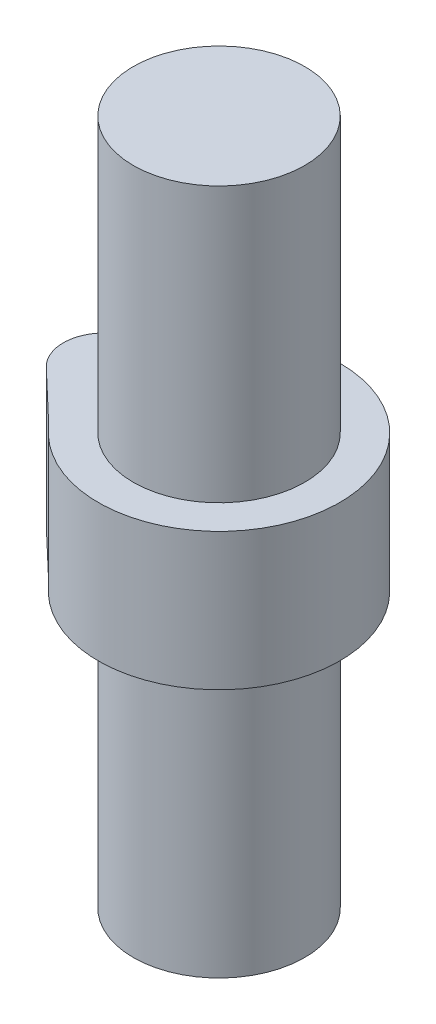
ISO-10303-21;
HEADER;
FILE_DESCRIPTION(('STEP AP214'),'2;1');
FILE_NAME('part.step','',(''),(''),'','','');
FILE_SCHEMA(('AUTOMOTIVE_DESIGN { 1 0 10303 214 1 1 1 1 }'));
ENDSEC;
DATA;
#1=APPLICATION_CONTEXT('core data for automotive mechanical design processes');
#2=APPLICATION_PROTOCOL_DEFINITION('international standard','automotive_design',2000,#1);
#3=PRODUCT_CONTEXT('',#1,'mechanical');
#4=PRODUCT('Part','Part','',(#3));
#5=PRODUCT_RELATED_PRODUCT_CATEGORY('part','',(#4));
#6=PRODUCT_DEFINITION_FORMATION('','',#4);
#7=PRODUCT_DEFINITION_CONTEXT('part definition',#1,'design');
#8=PRODUCT_DEFINITION('design','',#6,#7);
#9=PRODUCT_DEFINITION_SHAPE('','',#8);
#10=(LENGTH_UNIT() NAMED_UNIT(*) SI_UNIT(.MILLI.,.METRE.));
#11=(NAMED_UNIT(*) PLANE_ANGLE_UNIT() SI_UNIT($,.RADIAN.));
#12=(NAMED_UNIT(*) SI_UNIT($,.STERADIAN.) SOLID_ANGLE_UNIT());
#13=UNCERTAINTY_MEASURE_WITH_UNIT(LENGTH_MEASURE(1.E-05),#10,'distance_accuracy_value','');
#14=(GEOMETRIC_REPRESENTATION_CONTEXT(3) GLOBAL_UNCERTAINTY_ASSIGNED_CONTEXT((#13)) GLOBAL_UNIT_ASSIGNED_CONTEXT((#10,
#11,#12)) REPRESENTATION_CONTEXT('',''));
#15=CARTESIAN_POINT('',(0.,0.,0.));
#16=DIRECTION('',(0.,0.,1.));
#17=DIRECTION('',(1.,0.,0.));
#18=AXIS2_PLACEMENT_3D('',#15,#16,#17);
#19=CARTESIAN_POINT('',(0.,30.,0.));
#20=DIRECTION('',(0.,1.,0.));
#21=DIRECTION('',(0.,0.,1.));
#22=AXIS2_PLACEMENT_3D('',#19,#20,#21);
#23=PLANE('',#22);
#24=DIRECTION('',(-0.721222081139076,0.,0.692703911983626));
#25=VECTOR('',#24,1.);
#26=CARTESIAN_POINT('',(-6.25,30.,-6.19495762697373));
#27=LINE('',#26,#25);
#28=CARTESIAN_POINT('',(-6.25,30.,-6.19495762697373));
#29=VERTEX_POINT('',#28);
#30=CARTESIAN_POINT('',(-10.4377377549711,30.,-2.17280910838089));
#31=VERTEX_POINT('',#30);
#32=EDGE_CURVE('E93',#29,#31,#27,.T.);
#33=ORIENTED_EDGE('',*,*,#32,.T.);
#34=CARTESIAN_POINT('',(-8.35962601902018,30.,-0.00914286496365557));
#35=DIRECTION('',(0.,1.,0.));
#36=DIRECTION('',(0.,0.,1.));
#37=AXIS2_PLACEMENT_3D('',#34,#35,#36);
#38=CIRCLE('',#37,3.);
#39=CARTESIAN_POINT('',(-10.4286039599942,30.,2.16325909594576));
#40=VERTEX_POINT('',#39);
#41=EDGE_CURVE('E11',#31,#40,#38,.T.);
#42=ORIENTED_EDGE('',*,*,#41,.T.);
#43=DIRECTION('',(0.724133986969807,0.,0.689659313657991));
#44=VECTOR('',#43,1.);
#45=CARTESIAN_POINT('',(-12.7,30.,0.));
#46=LINE('',#45,#44);
#47=CARTESIAN_POINT('',(-6.65735154554284,30.,5.75496919184267));
#48=VERTEX_POINT('',#47);
#49=EDGE_CURVE('E75',#40,#48,#46,.T.);
#50=ORIENTED_EDGE('',*,*,#49,.T.);
#51=CARTESIAN_POINT('',(0.,30.,0.));
#52=DIRECTION('',(0.,1.,0.));
#53=DIRECTION('',(0.,0.,1.));
#54=AXIS2_PLACEMENT_3D('',#51,#52,#53);
#55=CIRCLE('',#54,8.8);
#56=EDGE_CURVE('E78',#48,#29,#55,.T.);
#57=ORIENTED_EDGE('',*,*,#56,.T.);
#58=EDGE_LOOP('',(#33,#42,#50,#57));
#59=FACE_BOUND('',#58,.T.);
#60=CARTESIAN_POINT('',(0.,30.,0.));
#61=DIRECTION('',(0.,1.,0.));
#62=DIRECTION('',(0.,0.,1.));
#63=AXIS2_PLACEMENT_3D('',#60,#61,#62);
#64=CIRCLE('',#63,6.25);
#65=CARTESIAN_POINT('',(0.,30.,6.25));
#66=VERTEX_POINT('',#65);
#67=EDGE_CURVE('E118',#66,#66,#64,.T.);
#68=ORIENTED_EDGE('',*,*,#67,.F.);
#69=EDGE_LOOP('',(#68));
#70=FACE_BOUND('',#69,.T.);
#71=ADVANCED_FACE('F35',(#59,#70),#23,.T.);
#72=CARTESIAN_POINT('',(0.,20.,0.));
#73=DIRECTION('',(0.,-1.,0.));
#74=DIRECTION('',(0.,0.,-1.));
#75=AXIS2_PLACEMENT_3D('',#72,#73,#74);
#76=CYLINDRICAL_SURFACE('',#75,6.25);
#77=CARTESIAN_POINT('',(0.,20.,0.));
#78=DIRECTION('',(0.,1.,0.));
#79=DIRECTION('',(0.,0.,1.));
#80=AXIS2_PLACEMENT_3D('',#77,#78,#79);
#81=CIRCLE('',#80,6.25);
#82=CARTESIAN_POINT('',(0.,20.,6.25));
#83=VERTEX_POINT('',#82);
#84=EDGE_CURVE('E101',#83,#83,#81,.T.);
#85=ORIENTED_EDGE('',*,*,#84,.F.);
#86=EDGE_LOOP('',(#85));
#87=FACE_BOUND('',#86,.T.);
#88=CARTESIAN_POINT('',(0.,0.,0.));
#89=DIRECTION('',(0.,1.,0.));
#90=DIRECTION('',(0.,0.,1.));
#91=AXIS2_PLACEMENT_3D('',#88,#89,#90);
#92=CIRCLE('',#91,6.25);
#93=CARTESIAN_POINT('',(0.,0.,6.25));
#94=VERTEX_POINT('',#93);
#95=EDGE_CURVE('E98',#94,#94,#92,.T.);
#96=ORIENTED_EDGE('',*,*,#95,.T.);
#97=EDGE_LOOP('',(#96));
#98=FACE_BOUND('',#97,.T.);
#99=ADVANCED_FACE('F133',(#87,#98),#76,.T.);
#100=CARTESIAN_POINT('',(0.,0.,0.));
#101=DIRECTION('',(0.,1.,0.));
#102=DIRECTION('',(0.,0.,1.));
#103=AXIS2_PLACEMENT_3D('',#100,#101,#102);
#104=PLANE('',#103);
#105=ORIENTED_EDGE('',*,*,#95,.F.);
#106=EDGE_LOOP('',(#105));
#107=FACE_BOUND('',#106,.T.);
#108=ADVANCED_FACE('F138',(#107),#104,.F.);
#109=CARTESIAN_POINT('',(0.,20.,0.));
#110=DIRECTION('',(0.,1.,0.));
#111=DIRECTION('',(0.,0.,1.));
#112=AXIS2_PLACEMENT_3D('',#109,#110,#111);
#113=PLANE('',#112);
#114=DIRECTION('',(0.724133986969807,0.,0.689659313657991));
#115=VECTOR('',#114,1.);
#116=CARTESIAN_POINT('',(-12.7,20.,0.));
#117=LINE('',#116,#115);
#118=CARTESIAN_POINT('',(-10.4286039599942,20.,2.16325909594576));
#119=VERTEX_POINT('',#118);
#120=CARTESIAN_POINT('',(-6.65735154554284,20.,5.75496919184267));
#121=VERTEX_POINT('',#120);
#122=EDGE_CURVE('E96',#119,#121,#117,.T.);
#123=ORIENTED_EDGE('',*,*,#122,.F.);
#124=CARTESIAN_POINT('',(-8.35962601902018,20.,-0.00914286496365557));
#125=DIRECTION('',(0.,1.,0.));
#126=DIRECTION('',(0.,0.,1.));
#127=AXIS2_PLACEMENT_3D('',#124,#125,#126);
#128=CIRCLE('',#127,3.);
#129=CARTESIAN_POINT('',(-10.4377377549711,20.,-2.17280910838089));
#130=VERTEX_POINT('',#129);
#131=EDGE_CURVE('E57',#119,#130,#128,.F.);
#132=ORIENTED_EDGE('',*,*,#131,.T.);
#133=DIRECTION('',(-0.721222081139076,0.,0.692703911983626));
#134=VECTOR('',#133,1.);
#135=CARTESIAN_POINT('',(-6.25,20.,-6.19495762697373));
#136=LINE('',#135,#134);
#137=CARTESIAN_POINT('',(-6.25,20.,-6.19495762697373));
#138=VERTEX_POINT('',#137);
#139=EDGE_CURVE('E85',#138,#130,#136,.T.);
#140=ORIENTED_EDGE('',*,*,#139,.F.);
#141=CARTESIAN_POINT('',(0.,20.,0.));
#142=DIRECTION('',(0.,1.,0.));
#143=DIRECTION('',(0.,0.,1.));
#144=AXIS2_PLACEMENT_3D('',#141,#142,#143);
#145=CIRCLE('',#144,8.8);
#146=EDGE_CURVE('E113',#121,#138,#145,.T.);
#147=ORIENTED_EDGE('',*,*,#146,.F.);
#148=EDGE_LOOP('',(#123,#132,#140,#147));
#149=FACE_BOUND('',#148,.T.);
#150=ORIENTED_EDGE('',*,*,#84,.T.);
#151=EDGE_LOOP('',(#150));
#152=FACE_BOUND('',#151,.T.);
#153=ADVANCED_FACE('F111',(#149,#152),#113,.F.);
#154=CARTESIAN_POINT('',(-12.7,30.,0.));
#155=DIRECTION('',(0.689659313657991,0.,-0.724133986969807));
#156=DIRECTION('',(-0.724133986969807,0.,-0.689659313657991));
#157=AXIS2_PLACEMENT_3D('',#154,#155,#156);
#158=PLANE('',#157);
#159=ORIENTED_EDGE('',*,*,#49,.F.);
#160=DIRECTION('',(0.,-1.,0.));
#161=VECTOR('',#160,1.);
#162=CARTESIAN_POINT('',(-10.4286039599942,30.,2.16325909594576));
#163=LINE('',#162,#161);
#164=EDGE_CURVE('E107',#40,#119,#163,.T.);
#165=ORIENTED_EDGE('',*,*,#164,.T.);
#166=ORIENTED_EDGE('',*,*,#122,.T.);
#167=DIRECTION('',(0.,-1.,0.));
#168=VECTOR('',#167,1.);
#169=CARTESIAN_POINT('',(-6.65735154554284,30.,5.75496919184267));
#170=LINE('',#169,#168);
#171=EDGE_CURVE('E90',#48,#121,#170,.T.);
#172=ORIENTED_EDGE('',*,*,#171,.F.);
#173=EDGE_LOOP('',(#159,#165,#166,#172));
#174=FACE_BOUND('',#173,.T.);
#175=ADVANCED_FACE('F95',(#174),#158,.F.);
#176=CARTESIAN_POINT('',(0.,30.,0.));
#177=DIRECTION('',(0.,-1.,0.));
#178=DIRECTION('',(0.,0.,-1.));
#179=AXIS2_PLACEMENT_3D('',#176,#177,#178);
#180=CYLINDRICAL_SURFACE('',#179,8.8);
#181=ORIENTED_EDGE('',*,*,#146,.T.);
#182=DIRECTION('',(0.,-1.,0.));
#183=VECTOR('',#182,1.);
#184=CARTESIAN_POINT('',(-6.25,30.,-6.19495762697373));
#185=LINE('',#184,#183);
#186=EDGE_CURVE('E92',#29,#138,#185,.T.);
#187=ORIENTED_EDGE('',*,*,#186,.F.);
#188=ORIENTED_EDGE('',*,*,#56,.F.);
#189=ORIENTED_EDGE('',*,*,#171,.T.);
#190=EDGE_LOOP('',(#181,#187,#188,#189));
#191=FACE_BOUND('',#190,.T.);
#192=ADVANCED_FACE('F89',(#191),#180,.T.);
#193=CARTESIAN_POINT('',(-6.25,30.,-6.19495762697373));
#194=DIRECTION('',(0.692703911983626,0.,0.721222081139076));
#195=DIRECTION('',(0.721222081139076,0.,-0.692703911983626));
#196=AXIS2_PLACEMENT_3D('',#193,#194,#195);
#197=PLANE('',#196);
#198=ORIENTED_EDGE('',*,*,#139,.T.);
#199=DIRECTION('',(0.,-1.,0.));
#200=VECTOR('',#199,1.);
#201=CARTESIAN_POINT('',(-10.4377377549711,30.,-2.17280910838089));
#202=LINE('',#201,#200);
#203=EDGE_CURVE('E43',#130,#31,#202,.F.);
#204=ORIENTED_EDGE('',*,*,#203,.T.);
#205=ORIENTED_EDGE('',*,*,#32,.F.);
#206=ORIENTED_EDGE('',*,*,#186,.T.);
#207=EDGE_LOOP('',(#198,#204,#205,#206));
#208=FACE_BOUND('',#207,.T.);
#209=ADVANCED_FACE('F121',(#208),#197,.F.);
#210=CARTESIAN_POINT('',(-8.35962601902018,30.,-0.00914286496365557));
#211=DIRECTION('',(0.,-1.,0.));
#212=DIRECTION('',(0.,0.,-1.));
#213=AXIS2_PLACEMENT_3D('',#210,#211,#212);
#214=CYLINDRICAL_SURFACE('',#213,3.);
#215=ORIENTED_EDGE('',*,*,#41,.F.);
#216=ORIENTED_EDGE('',*,*,#203,.F.);
#217=ORIENTED_EDGE('',*,*,#131,.F.);
#218=ORIENTED_EDGE('',*,*,#164,.F.);
#219=EDGE_LOOP('',(#215,#216,#217,#218));
#220=FACE_BOUND('',#219,.T.);
#221=ADVANCED_FACE('F37',(#220),#214,.T.);
#222=CARTESIAN_POINT('',(0.,50.,0.));
#223=DIRECTION('',(0.,-1.,0.));
#224=DIRECTION('',(0.,0.,-1.));
#225=AXIS2_PLACEMENT_3D('',#222,#223,#224);
#226=CYLINDRICAL_SURFACE('',#225,6.25);
#227=CARTESIAN_POINT('',(0.,50.,0.));
#228=DIRECTION('',(0.,1.,0.));
#229=DIRECTION('',(0.,0.,1.));
#230=AXIS2_PLACEMENT_3D('',#227,#228,#229);
#231=CIRCLE('',#230,6.25);
#232=CARTESIAN_POINT('',(0.,50.,6.25));
#233=VERTEX_POINT('',#232);
#234=EDGE_CURVE('E114',#233,#233,#231,.T.);
#235=ORIENTED_EDGE('',*,*,#234,.F.);
#236=EDGE_LOOP('',(#235));
#237=FACE_BOUND('',#236,.T.);
#238=ORIENTED_EDGE('',*,*,#67,.T.);
#239=EDGE_LOOP('',(#238));
#240=FACE_BOUND('',#239,.T.);
#241=ADVANCED_FACE('F123',(#237,#240),#226,.T.);
#242=CARTESIAN_POINT('',(0.,50.,0.));
#243=DIRECTION('',(0.,1.,0.));
#244=DIRECTION('',(0.,0.,1.));
#245=AXIS2_PLACEMENT_3D('',#242,#243,#244);
#246=PLANE('',#245);
#247=ORIENTED_EDGE('',*,*,#234,.T.);
#248=EDGE_LOOP('',(#247));
#249=FACE_BOUND('',#248,.T.);
#250=ADVANCED_FACE('F128',(#249),#246,.T.);
#251=CLOSED_SHELL('',(#71,#99,#108,#153,#175,#192,#209,#221,#241,#250));
#252=MANIFOLD_SOLID_BREP('B2',#251);
#253=ADVANCED_BREP_SHAPE_REPRESENTATION('',(#18,#252),#14);
#254=SHAPE_DEFINITION_REPRESENTATION(#9,#253);
ENDSEC;
END-ISO-10303-21;
